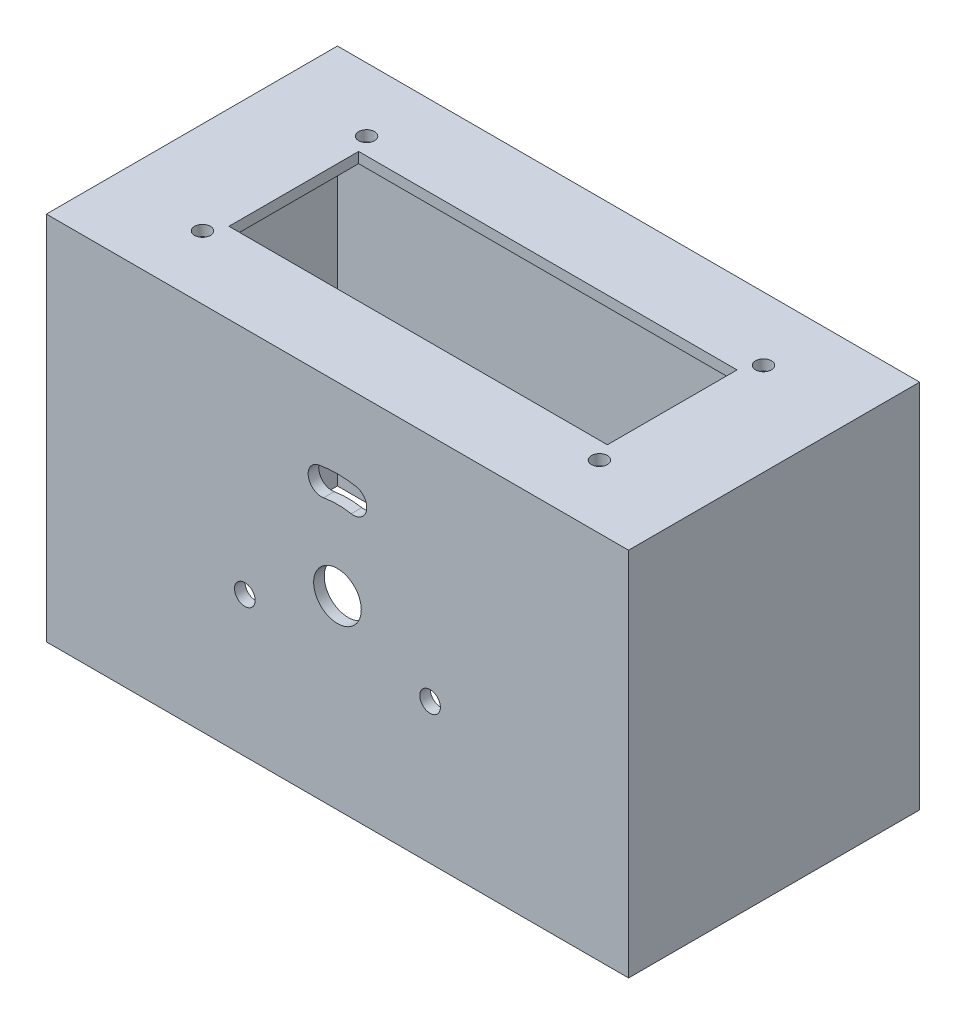
ISO-10303-21;
HEADER;
FILE_DESCRIPTION(('STEP AP214'),'2;1');
FILE_NAME('part.step','',(''),(''),'','','');
FILE_SCHEMA(('AUTOMOTIVE_DESIGN { 1 0 10303 214 1 1 1 1 }'));
ENDSEC;
DATA;
#1=APPLICATION_CONTEXT('core data for automotive mechanical design processes');
#2=APPLICATION_PROTOCOL_DEFINITION('international standard','automotive_design',2000,#1);
#3=PRODUCT_CONTEXT('',#1,'mechanical');
#4=PRODUCT('Part','Part','',(#3));
#5=PRODUCT_RELATED_PRODUCT_CATEGORY('part','',(#4));
#6=PRODUCT_DEFINITION_FORMATION('','',#4);
#7=PRODUCT_DEFINITION_CONTEXT('part definition',#1,'design');
#8=PRODUCT_DEFINITION('design','',#6,#7);
#9=PRODUCT_DEFINITION_SHAPE('','',#8);
#10=(LENGTH_UNIT() NAMED_UNIT(*) SI_UNIT(.MILLI.,.METRE.));
#11=(NAMED_UNIT(*) PLANE_ANGLE_UNIT() SI_UNIT($,.RADIAN.));
#12=(NAMED_UNIT(*) SI_UNIT($,.STERADIAN.) SOLID_ANGLE_UNIT());
#13=UNCERTAINTY_MEASURE_WITH_UNIT(LENGTH_MEASURE(1.E-05),#10,'distance_accuracy_value','');
#14=(GEOMETRIC_REPRESENTATION_CONTEXT(3) GLOBAL_UNCERTAINTY_ASSIGNED_CONTEXT((#13)) GLOBAL_UNIT_ASSIGNED_CONTEXT((#10,
#11,#12)) REPRESENTATION_CONTEXT('',''));
#15=CARTESIAN_POINT('',(0.,0.,0.));
#16=DIRECTION('',(0.,0.,1.));
#17=DIRECTION('',(1.,0.,0.));
#18=AXIS2_PLACEMENT_3D('',#15,#16,#17);
#19=CARTESIAN_POINT('',(0.,35.,27.5));
#20=DIRECTION('',(0.,0.,1.));
#21=DIRECTION('',(1.,0.,0.));
#22=AXIS2_PLACEMENT_3D('',#19,#20,#21);
#23=PLANE('',#22);
#24=CARTESIAN_POINT('',(-17.5,-8.5,27.5));
#25=DIRECTION('',(0.,0.,1.));
#26=DIRECTION('',(1.,0.,0.));
#27=AXIS2_PLACEMENT_3D('',#24,#25,#26);
#28=CIRCLE('',#27,1.95);
#29=CARTESIAN_POINT('',(-15.55,-8.5,27.5));
#30=VERTEX_POINT('',#29);
#31=EDGE_CURVE('E133',#30,#30,#28,.T.);
#32=ORIENTED_EDGE('',*,*,#31,.F.);
#33=EDGE_LOOP('',(#32));
#34=FACE_BOUND('',#33,.T.);
#35=CARTESIAN_POINT('',(17.5,-8.5,27.5));
#36=DIRECTION('',(0.,0.,1.));
#37=DIRECTION('',(1.,0.,0.));
#38=AXIS2_PLACEMENT_3D('',#35,#36,#37);
#39=CIRCLE('',#38,1.95);
#40=CARTESIAN_POINT('',(19.45,-8.5,27.5));
#41=VERTEX_POINT('',#40);
#42=EDGE_CURVE('E275',#41,#41,#39,.T.);
#43=ORIENTED_EDGE('',*,*,#42,.F.);
#44=EDGE_LOOP('',(#43));
#45=FACE_BOUND('',#44,.T.);
#46=CARTESIAN_POINT('',(0.,0.,27.5));
#47=DIRECTION('',(0.,0.,1.));
#48=DIRECTION('',(1.,0.,0.));
#49=AXIS2_PLACEMENT_3D('',#46,#47,#48);
#50=CIRCLE('',#49,4.50000000000004);
#51=CARTESIAN_POINT('',(4.50000000000008,0.,27.5));
#52=VERTEX_POINT('',#51);
#53=EDGE_CURVE('E282',#52,#52,#50,.T.);
#54=ORIENTED_EDGE('',*,*,#53,.F.);
#55=EDGE_LOOP('',(#54));
#56=FACE_BOUND('',#55,.T.);
#57=DIRECTION('',(-1.,0.,0.));
#58=VECTOR('',#57,1.);
#59=CARTESIAN_POINT('',(0.,-35.,27.5));
#60=LINE('',#59,#58);
#61=CARTESIAN_POINT('',(55.,-35.,27.5));
#62=VERTEX_POINT('',#61);
#63=CARTESIAN_POINT('',(-55.,-35.,27.5));
#64=VERTEX_POINT('',#63);
#65=EDGE_CURVE('E376',#62,#64,#60,.T.);
#66=ORIENTED_EDGE('',*,*,#65,.F.);
#67=DIRECTION('',(0.,-1.,0.));
#68=VECTOR('',#67,1.);
#69=CARTESIAN_POINT('',(55.,35.,27.5));
#70=LINE('',#69,#68);
#71=CARTESIAN_POINT('',(55.,35.,27.5));
#72=VERTEX_POINT('',#71);
#73=EDGE_CURVE('E13',#72,#62,#70,.T.);
#74=ORIENTED_EDGE('',*,*,#73,.F.);
#75=DIRECTION('',(-1.,0.,0.));
#76=VECTOR('',#75,1.);
#77=CARTESIAN_POINT('',(0.,35.,27.5));
#78=LINE('',#77,#76);
#79=CARTESIAN_POINT('',(-55.,35.,27.5));
#80=VERTEX_POINT('',#79);
#81=EDGE_CURVE('E352',#72,#80,#78,.T.);
#82=ORIENTED_EDGE('',*,*,#81,.T.);
#83=DIRECTION('',(0.,-1.,0.));
#84=VECTOR('',#83,1.);
#85=CARTESIAN_POINT('',(-55.,35.,27.5));
#86=LINE('',#85,#84);
#87=EDGE_CURVE('E387',#80,#64,#86,.T.);
#88=ORIENTED_EDGE('',*,*,#87,.T.);
#89=EDGE_LOOP('',(#66,#74,#82,#88));
#90=FACE_BOUND('',#89,.T.);
#91=CARTESIAN_POINT('',(0.,0.,27.5));
#92=DIRECTION('',(0.,0.,-1.));
#93=DIRECTION('',(-1.,0.,0.));
#94=AXIS2_PLACEMENT_3D('',#91,#92,#93);
#95=CIRCLE('',#94,15.);
#96=CARTESIAN_POINT('',(-2.604722665004,14.7721162951832,27.5));
#97=VERTEX_POINT('',#96);
#98=CARTESIAN_POINT('',(2.604722665004,14.7721162951832,27.5));
#99=VERTEX_POINT('',#98);
#100=EDGE_CURVE('E252',#97,#99,#95,.T.);
#101=ORIENTED_EDGE('',*,*,#100,.F.);
#102=CARTESIAN_POINT('',(-3.03884310917124,17.2341356777136,27.5));
#103=DIRECTION('',(0.,0.,-1.));
#104=DIRECTION('',(-1.,0.,0.));
#105=AXIS2_PLACEMENT_3D('',#102,#103,#104);
#106=CIRCLE('',#105,2.5);
#107=CARTESIAN_POINT('',(-3.47296355333859,19.6961550602441,27.5));
#108=VERTEX_POINT('',#107);
#109=EDGE_CURVE('E246',#108,#97,#106,.F.);
#110=ORIENTED_EDGE('',*,*,#109,.F.);
#111=CARTESIAN_POINT('',(0.,0.,27.5));
#112=DIRECTION('',(0.,0.,-1.));
#113=DIRECTION('',(-1.,0.,0.));
#114=AXIS2_PLACEMENT_3D('',#111,#112,#113);
#115=CIRCLE('',#114,20.);
#116=CARTESIAN_POINT('',(3.4729635533386,19.6961550602442,27.5));
#117=VERTEX_POINT('',#116);
#118=EDGE_CURVE('E255',#108,#117,#115,.T.);
#119=ORIENTED_EDGE('',*,*,#118,.T.);
#120=CARTESIAN_POINT('',(3.03884310917135,17.2341356777136,27.5));
#121=DIRECTION('',(0.,0.,-1.));
#122=DIRECTION('',(-1.,0.,0.));
#123=AXIS2_PLACEMENT_3D('',#120,#121,#122);
#124=CIRCLE('',#123,2.5);
#125=EDGE_CURVE('E146',#117,#99,#124,.T.);
#126=ORIENTED_EDGE('',*,*,#125,.T.);
#127=EDGE_LOOP('',(#101,#110,#119,#126));
#128=FACE_BOUND('',#127,.T.);
#129=ADVANCED_FACE('F129',(#34,#45,#56,#90,#128),#23,.T.);
#130=CARTESIAN_POINT('',(0.,35.,25.5));
#131=DIRECTION('',(0.,0.,1.));
#132=DIRECTION('',(1.,0.,0.));
#133=AXIS2_PLACEMENT_3D('',#130,#131,#132);
#134=PLANE('',#133);
#135=DIRECTION('',(0.,-1.,0.));
#136=VECTOR('',#135,1.);
#137=CARTESIAN_POINT('',(-53.,35.,25.5));
#138=LINE('',#137,#136);
#139=CARTESIAN_POINT('',(-53.,33.,25.5));
#140=VERTEX_POINT('',#139);
#141=CARTESIAN_POINT('',(-53.,-35.,25.5));
#142=VERTEX_POINT('',#141);
#143=EDGE_CURVE('E397',#140,#142,#138,.T.);
#144=ORIENTED_EDGE('',*,*,#143,.F.);
#145=DIRECTION('',(1.,0.,0.));
#146=VECTOR('',#145,1.);
#147=CARTESIAN_POINT('',(0.,33.,25.5));
#148=LINE('',#147,#146);
#149=CARTESIAN_POINT('',(53.,33.,25.5));
#150=VERTEX_POINT('',#149);
#151=EDGE_CURVE('E347',#140,#150,#148,.T.);
#152=ORIENTED_EDGE('',*,*,#151,.T.);
#153=DIRECTION('',(0.,-1.,0.));
#154=VECTOR('',#153,1.);
#155=CARTESIAN_POINT('',(53.,35.,25.5));
#156=LINE('',#155,#154);
#157=CARTESIAN_POINT('',(53.,-35.,25.5));
#158=VERTEX_POINT('',#157);
#159=EDGE_CURVE('E390',#150,#158,#156,.T.);
#160=ORIENTED_EDGE('',*,*,#159,.T.);
#161=DIRECTION('',(-1.,0.,0.));
#162=VECTOR('',#161,1.);
#163=CARTESIAN_POINT('',(0.,-35.,25.5));
#164=LINE('',#163,#162);
#165=EDGE_CURVE('E367',#158,#142,#164,.T.);
#166=ORIENTED_EDGE('',*,*,#165,.T.);
#167=EDGE_LOOP('',(#144,#152,#160,#166));
#168=FACE_BOUND('',#167,.T.);
#169=CARTESIAN_POINT('',(0.,0.,25.5));
#170=DIRECTION('',(0.,0.,1.));
#171=DIRECTION('',(1.,0.,0.));
#172=AXIS2_PLACEMENT_3D('',#169,#170,#171);
#173=CIRCLE('',#172,4.50000000000004);
#174=CARTESIAN_POINT('',(4.50000000000007,0.,25.5));
#175=VERTEX_POINT('',#174);
#176=EDGE_CURVE('E279',#175,#175,#173,.T.);
#177=ORIENTED_EDGE('',*,*,#176,.T.);
#178=EDGE_LOOP('',(#177));
#179=FACE_BOUND('',#178,.T.);
#180=CARTESIAN_POINT('',(17.5,-8.5,25.5));
#181=DIRECTION('',(0.,0.,1.));
#182=DIRECTION('',(1.,0.,0.));
#183=AXIS2_PLACEMENT_3D('',#180,#181,#182);
#184=CIRCLE('',#183,1.95);
#185=CARTESIAN_POINT('',(19.45,-8.5,25.5));
#186=VERTEX_POINT('',#185);
#187=EDGE_CURVE('E400',#186,#186,#184,.T.);
#188=ORIENTED_EDGE('',*,*,#187,.T.);
#189=EDGE_LOOP('',(#188));
#190=FACE_BOUND('',#189,.T.);
#191=CARTESIAN_POINT('',(-17.5,-8.5,25.5));
#192=DIRECTION('',(0.,0.,1.));
#193=DIRECTION('',(1.,0.,0.));
#194=AXIS2_PLACEMENT_3D('',#191,#192,#193);
#195=CIRCLE('',#194,1.95);
#196=CARTESIAN_POINT('',(-15.55,-8.5,25.5));
#197=VERTEX_POINT('',#196);
#198=EDGE_CURVE('E283',#197,#197,#195,.T.);
#199=ORIENTED_EDGE('',*,*,#198,.T.);
#200=EDGE_LOOP('',(#199));
#201=FACE_BOUND('',#200,.T.);
#202=CARTESIAN_POINT('',(-3.03884310917124,17.2341356777136,25.5000000000001));
#203=DIRECTION('',(0.,0.,-1.));
#204=DIRECTION('',(-1.,0.,0.));
#205=AXIS2_PLACEMENT_3D('',#202,#203,#204);
#206=CIRCLE('',#205,2.5);
#207=CARTESIAN_POINT('',(-3.4729635533386,19.6961550602442,25.5));
#208=VERTEX_POINT('',#207);
#209=CARTESIAN_POINT('',(-2.604722665004,14.7721162951832,25.5000000000001));
#210=VERTEX_POINT('',#209);
#211=EDGE_CURVE('E154',#208,#210,#206,.F.);
#212=ORIENTED_EDGE('',*,*,#211,.T.);
#213=CARTESIAN_POINT('',(0.,0.,25.5000000000001));
#214=DIRECTION('',(0.,0.,-1.));
#215=DIRECTION('',(-1.,0.,0.));
#216=AXIS2_PLACEMENT_3D('',#213,#214,#215);
#217=CIRCLE('',#216,15.);
#218=CARTESIAN_POINT('',(2.604722665004,14.7721162951832,25.5000000000001));
#219=VERTEX_POINT('',#218);
#220=EDGE_CURVE('E260',#210,#219,#217,.T.);
#221=ORIENTED_EDGE('',*,*,#220,.T.);
#222=CARTESIAN_POINT('',(3.03884310917135,17.2341356777136,25.5000000000001));
#223=DIRECTION('',(0.,0.,-1.));
#224=DIRECTION('',(-1.,0.,0.));
#225=AXIS2_PLACEMENT_3D('',#222,#223,#224);
#226=CIRCLE('',#225,2.5);
#227=CARTESIAN_POINT('',(3.47296355333859,19.6961550602441,25.5000000000001));
#228=VERTEX_POINT('',#227);
#229=EDGE_CURVE('E263',#228,#219,#226,.T.);
#230=ORIENTED_EDGE('',*,*,#229,.F.);
#231=CARTESIAN_POINT('',(0.,0.,25.5000000000001));
#232=DIRECTION('',(0.,0.,-1.));
#233=DIRECTION('',(-1.,0.,0.));
#234=AXIS2_PLACEMENT_3D('',#231,#232,#233);
#235=CIRCLE('',#234,20.);
#236=EDGE_CURVE('E269',#208,#228,#235,.T.);
#237=ORIENTED_EDGE('',*,*,#236,.F.);
#238=EDGE_LOOP('',(#212,#221,#230,#237));
#239=FACE_BOUND('',#238,.T.);
#240=ADVANCED_FACE('F413',(#168,#179,#190,#201,#239),#134,.F.);
#241=CARTESIAN_POINT('',(55.,35.,0.));
#242=DIRECTION('',(-1.,0.,0.));
#243=DIRECTION('',(0.,0.,1.));
#244=AXIS2_PLACEMENT_3D('',#241,#242,#243);
#245=PLANE('',#244);
#246=DIRECTION('',(0.,0.,-1.));
#247=VECTOR('',#246,1.);
#248=CARTESIAN_POINT('',(55.,-35.,0.));
#249=LINE('',#248,#247);
#250=CARTESIAN_POINT('',(55.,-35.,-27.5));
#251=VERTEX_POINT('',#250);
#252=EDGE_CURVE('E379',#62,#251,#249,.T.);
#253=ORIENTED_EDGE('',*,*,#252,.T.);
#254=DIRECTION('',(0.,-1.,0.));
#255=VECTOR('',#254,1.);
#256=CARTESIAN_POINT('',(55.,35.,-27.5));
#257=LINE('',#256,#255);
#258=CARTESIAN_POINT('',(55.,35.,-27.5));
#259=VERTEX_POINT('',#258);
#260=EDGE_CURVE('E138',#259,#251,#257,.T.);
#261=ORIENTED_EDGE('',*,*,#260,.F.);
#262=DIRECTION('',(0.,0.,-1.));
#263=VECTOR('',#262,1.);
#264=CARTESIAN_POINT('',(55.,35.,0.));
#265=LINE('',#264,#263);
#266=EDGE_CURVE('E355',#72,#259,#265,.T.);
#267=ORIENTED_EDGE('',*,*,#266,.F.);
#268=ORIENTED_EDGE('',*,*,#73,.T.);
#269=EDGE_LOOP('',(#253,#261,#267,#268));
#270=FACE_BOUND('',#269,.T.);
#271=ADVANCED_FACE('F433',(#270),#245,.F.);
#272=CARTESIAN_POINT('',(0.,35.,-27.5));
#273=DIRECTION('',(0.,0.,1.));
#274=DIRECTION('',(1.,0.,0.));
#275=AXIS2_PLACEMENT_3D('',#272,#273,#274);
#276=PLANE('',#275);
#277=DIRECTION('',(-1.,0.,0.));
#278=VECTOR('',#277,1.);
#279=CARTESIAN_POINT('',(0.,-35.,-27.5));
#280=LINE('',#279,#278);
#281=CARTESIAN_POINT('',(-55.,-35.,-27.5));
#282=VERTEX_POINT('',#281);
#283=EDGE_CURVE('E382',#251,#282,#280,.T.);
#284=ORIENTED_EDGE('',*,*,#283,.T.);
#285=DIRECTION('',(0.,-1.,0.));
#286=VECTOR('',#285,1.);
#287=CARTESIAN_POINT('',(-55.,35.,-27.5));
#288=LINE('',#287,#286);
#289=CARTESIAN_POINT('',(-55.,35.,-27.5));
#290=VERTEX_POINT('',#289);
#291=EDGE_CURVE('E389',#290,#282,#288,.T.);
#292=ORIENTED_EDGE('',*,*,#291,.F.);
#293=DIRECTION('',(-1.,0.,0.));
#294=VECTOR('',#293,1.);
#295=CARTESIAN_POINT('',(0.,35.,-27.5));
#296=LINE('',#295,#294);
#297=EDGE_CURVE('E359',#259,#290,#296,.T.);
#298=ORIENTED_EDGE('',*,*,#297,.F.);
#299=ORIENTED_EDGE('',*,*,#260,.T.);
#300=EDGE_LOOP('',(#284,#292,#298,#299));
#301=FACE_BOUND('',#300,.T.);
#302=ADVANCED_FACE('F430',(#301),#276,.F.);
#303=CARTESIAN_POINT('',(53.,35.,0.));
#304=DIRECTION('',(-1.,0.,0.));
#305=DIRECTION('',(0.,0.,1.));
#306=AXIS2_PLACEMENT_3D('',#303,#304,#305);
#307=PLANE('',#306);
#308=DIRECTION('',(0.,0.,1.));
#309=VECTOR('',#308,1.);
#310=CARTESIAN_POINT('',(53.,33.,0.));
#311=LINE('',#310,#309);
#312=CARTESIAN_POINT('',(53.,33.,-25.5));
#313=VERTEX_POINT('',#312);
#314=EDGE_CURVE('E344',#313,#150,#311,.T.);
#315=ORIENTED_EDGE('',*,*,#314,.F.);
#316=DIRECTION('',(0.,-1.,0.));
#317=VECTOR('',#316,1.);
#318=CARTESIAN_POINT('',(53.,35.,-25.5));
#319=LINE('',#318,#317);
#320=CARTESIAN_POINT('',(53.,-35.,-25.5));
#321=VERTEX_POINT('',#320);
#322=EDGE_CURVE('E364',#313,#321,#319,.T.);
#323=ORIENTED_EDGE('',*,*,#322,.T.);
#324=DIRECTION('',(0.,0.,-1.));
#325=VECTOR('',#324,1.);
#326=CARTESIAN_POINT('',(53.,-35.,0.));
#327=LINE('',#326,#325);
#328=EDGE_CURVE('E351',#158,#321,#327,.T.);
#329=ORIENTED_EDGE('',*,*,#328,.F.);
#330=ORIENTED_EDGE('',*,*,#159,.F.);
#331=EDGE_LOOP('',(#315,#323,#329,#330));
#332=FACE_BOUND('',#331,.T.);
#333=ADVANCED_FACE('F491',(#332),#307,.T.);
#334=CARTESIAN_POINT('',(-53.,35.,0.));
#335=DIRECTION('',(-1.,0.,0.));
#336=DIRECTION('',(0.,0.,1.));
#337=AXIS2_PLACEMENT_3D('',#334,#335,#336);
#338=PLANE('',#337);
#339=DIRECTION('',(0.,-1.,0.));
#340=VECTOR('',#339,1.);
#341=CARTESIAN_POINT('',(-53.,35.,-25.5));
#342=LINE('',#341,#340);
#343=CARTESIAN_POINT('',(-53.,33.,-25.5));
#344=VERTEX_POINT('',#343);
#345=CARTESIAN_POINT('',(-53.,-35.,-25.5));
#346=VERTEX_POINT('',#345);
#347=EDGE_CURVE('E395',#344,#346,#342,.T.);
#348=ORIENTED_EDGE('',*,*,#347,.F.);
#349=DIRECTION('',(0.,0.,1.));
#350=VECTOR('',#349,1.);
#351=CARTESIAN_POINT('',(-53.,33.,0.));
#352=LINE('',#351,#350);
#353=EDGE_CURVE('E349',#344,#140,#352,.T.);
#354=ORIENTED_EDGE('',*,*,#353,.T.);
#355=ORIENTED_EDGE('',*,*,#143,.T.);
#356=DIRECTION('',(0.,0.,-1.));
#357=VECTOR('',#356,1.);
#358=CARTESIAN_POINT('',(-53.,-35.,0.));
#359=LINE('',#358,#357);
#360=EDGE_CURVE('E370',#142,#346,#359,.T.);
#361=ORIENTED_EDGE('',*,*,#360,.T.);
#362=EDGE_LOOP('',(#348,#354,#355,#361));
#363=FACE_BOUND('',#362,.T.);
#364=ADVANCED_FACE('F496',(#363),#338,.F.);
#365=CARTESIAN_POINT('',(0.,35.,-25.5));
#366=DIRECTION('',(0.,0.,1.));
#367=DIRECTION('',(1.,0.,0.));
#368=AXIS2_PLACEMENT_3D('',#365,#366,#367);
#369=PLANE('',#368);
#370=DIRECTION('',(1.,0.,0.));
#371=VECTOR('',#370,1.);
#372=CARTESIAN_POINT('',(0.,33.,-25.5));
#373=LINE('',#372,#371);
#374=EDGE_CURVE('E341',#344,#313,#373,.T.);
#375=ORIENTED_EDGE('',*,*,#374,.F.);
#376=ORIENTED_EDGE('',*,*,#347,.T.);
#377=DIRECTION('',(-1.,0.,0.));
#378=VECTOR('',#377,1.);
#379=CARTESIAN_POINT('',(0.,-35.,-25.5));
#380=LINE('',#379,#378);
#381=EDGE_CURVE('E373',#321,#346,#380,.T.);
#382=ORIENTED_EDGE('',*,*,#381,.F.);
#383=ORIENTED_EDGE('',*,*,#322,.F.);
#384=EDGE_LOOP('',(#375,#376,#382,#383));
#385=FACE_BOUND('',#384,.T.);
#386=ADVANCED_FACE('F488',(#385),#369,.T.);
#387=CARTESIAN_POINT('',(-55.,35.,0.));
#388=DIRECTION('',(-1.,0.,0.));
#389=DIRECTION('',(0.,0.,1.));
#390=AXIS2_PLACEMENT_3D('',#387,#388,#389);
#391=PLANE('',#390);
#392=DIRECTION('',(0.,0.,-1.));
#393=VECTOR('',#392,1.);
#394=CARTESIAN_POINT('',(-55.,-35.,0.));
#395=LINE('',#394,#393);
#396=EDGE_CURVE('E356',#64,#282,#395,.T.);
#397=ORIENTED_EDGE('',*,*,#396,.F.);
#398=ORIENTED_EDGE('',*,*,#87,.F.);
#399=DIRECTION('',(0.,0.,-1.));
#400=VECTOR('',#399,1.);
#401=CARTESIAN_POINT('',(-55.,35.,0.));
#402=LINE('',#401,#400);
#403=EDGE_CURVE('E361',#80,#290,#402,.T.);
#404=ORIENTED_EDGE('',*,*,#403,.T.);
#405=ORIENTED_EDGE('',*,*,#291,.T.);
#406=EDGE_LOOP('',(#397,#398,#404,#405));
#407=FACE_BOUND('',#406,.T.);
#408=ADVANCED_FACE('F426',(#407),#391,.T.);
#409=CARTESIAN_POINT('',(0.,35.,0.));
#410=DIRECTION('',(0.,1.,0.));
#411=DIRECTION('',(0.,0.,1.));
#412=AXIS2_PLACEMENT_3D('',#409,#410,#411);
#413=PLANE('',#412);
#414=ORIENTED_EDGE('',*,*,#81,.F.);
#415=ORIENTED_EDGE('',*,*,#266,.T.);
#416=ORIENTED_EDGE('',*,*,#297,.T.);
#417=ORIENTED_EDGE('',*,*,#403,.F.);
#418=EDGE_LOOP('',(#414,#415,#416,#417));
#419=FACE_BOUND('',#418,.T.);
#420=CARTESIAN_POINT('',(-37.5,35.,15.5));
#421=DIRECTION('',(0.,1.,0.));
#422=DIRECTION('',(0.,0.,1.));
#423=AXIS2_PLACEMENT_3D('',#420,#421,#422);
#424=CIRCLE('',#423,1.5);
#425=CARTESIAN_POINT('',(-37.5,35.,17.));
#426=VERTEX_POINT('',#425);
#427=EDGE_CURVE('E286',#426,#426,#424,.T.);
#428=ORIENTED_EDGE('',*,*,#427,.F.);
#429=EDGE_LOOP('',(#428));
#430=FACE_BOUND('',#429,.T.);
#431=CARTESIAN_POINT('',(-37.5,35.,-15.5));
#432=DIRECTION('',(0.,1.,0.));
#433=DIRECTION('',(0.,0.,1.));
#434=AXIS2_PLACEMENT_3D('',#431,#432,#433);
#435=CIRCLE('',#434,1.5);
#436=CARTESIAN_POINT('',(-37.5,35.,-14.));
#437=VERTEX_POINT('',#436);
#438=EDGE_CURVE('E290',#437,#437,#435,.T.);
#439=ORIENTED_EDGE('',*,*,#438,.F.);
#440=EDGE_LOOP('',(#439));
#441=FACE_BOUND('',#440,.T.);
#442=CARTESIAN_POINT('',(37.5,35.,-15.5));
#443=DIRECTION('',(0.,1.,0.));
#444=DIRECTION('',(0.,0.,1.));
#445=AXIS2_PLACEMENT_3D('',#442,#443,#444);
#446=CIRCLE('',#445,1.5);
#447=CARTESIAN_POINT('',(37.5,35.,-14.));
#448=VERTEX_POINT('',#447);
#449=EDGE_CURVE('E296',#448,#448,#446,.T.);
#450=ORIENTED_EDGE('',*,*,#449,.F.);
#451=EDGE_LOOP('',(#450));
#452=FACE_BOUND('',#451,.T.);
#453=CARTESIAN_POINT('',(37.5,35.,15.5));
#454=DIRECTION('',(0.,1.,0.));
#455=DIRECTION('',(0.,0.,1.));
#456=AXIS2_PLACEMENT_3D('',#453,#454,#455);
#457=CIRCLE('',#456,1.5);
#458=CARTESIAN_POINT('',(37.5,35.,17.));
#459=VERTEX_POINT('',#458);
#460=EDGE_CURVE('E302',#459,#459,#457,.T.);
#461=ORIENTED_EDGE('',*,*,#460,.F.);
#462=EDGE_LOOP('',(#461));
#463=FACE_BOUND('',#462,.T.);
#464=DIRECTION('',(0.,0.,1.));
#465=VECTOR('',#464,1.);
#466=CARTESIAN_POINT('',(35.75,35.,0.));
#467=LINE('',#466,#465);
#468=CARTESIAN_POINT('',(35.75,35.,-12.25));
#469=VERTEX_POINT('',#468);
#470=CARTESIAN_POINT('',(35.75,35.,12.25));
#471=VERTEX_POINT('',#470);
#472=EDGE_CURVE('E308',#469,#471,#467,.T.);
#473=ORIENTED_EDGE('',*,*,#472,.T.);
#474=DIRECTION('',(1.,0.,0.));
#475=VECTOR('',#474,1.);
#476=CARTESIAN_POINT('',(0.,35.,12.25));
#477=LINE('',#476,#475);
#478=CARTESIAN_POINT('',(-35.75,35.,12.25));
#479=VERTEX_POINT('',#478);
#480=EDGE_CURVE('E325',#479,#471,#477,.T.);
#481=ORIENTED_EDGE('',*,*,#480,.F.);
#482=DIRECTION('',(0.,0.,1.));
#483=VECTOR('',#482,1.);
#484=CARTESIAN_POINT('',(-35.75,35.,0.));
#485=LINE('',#484,#483);
#486=CARTESIAN_POINT('',(-35.75,35.,-12.25));
#487=VERTEX_POINT('',#486);
#488=EDGE_CURVE('E328',#487,#479,#485,.T.);
#489=ORIENTED_EDGE('',*,*,#488,.F.);
#490=DIRECTION('',(1.,0.,0.));
#491=VECTOR('',#490,1.);
#492=CARTESIAN_POINT('',(0.,35.,-12.25));
#493=LINE('',#492,#491);
#494=EDGE_CURVE('E314',#487,#469,#493,.T.);
#495=ORIENTED_EDGE('',*,*,#494,.T.);
#496=EDGE_LOOP('',(#473,#481,#489,#495));
#497=FACE_BOUND('',#496,.T.);
#498=ADVANCED_FACE('F436',(#419,#430,#441,#452,#463,#497),#413,.T.);
#499=CARTESIAN_POINT('',(0.,-35.,0.));
#500=DIRECTION('',(0.,1.,0.));
#501=DIRECTION('',(0.,0.,1.));
#502=AXIS2_PLACEMENT_3D('',#499,#500,#501);
#503=PLANE('',#502);
#504=ORIENTED_EDGE('',*,*,#328,.T.);
#505=ORIENTED_EDGE('',*,*,#381,.T.);
#506=ORIENTED_EDGE('',*,*,#360,.F.);
#507=ORIENTED_EDGE('',*,*,#165,.F.);
#508=EDGE_LOOP('',(#504,#505,#506,#507));
#509=FACE_BOUND('',#508,.T.);
#510=ORIENTED_EDGE('',*,*,#65,.T.);
#511=ORIENTED_EDGE('',*,*,#396,.T.);
#512=ORIENTED_EDGE('',*,*,#283,.F.);
#513=ORIENTED_EDGE('',*,*,#252,.F.);
#514=EDGE_LOOP('',(#510,#511,#512,#513));
#515=FACE_BOUND('',#514,.T.);
#516=ADVANCED_FACE('F424',(#509,#515),#503,.F.);
#517=CARTESIAN_POINT('',(0.,33.,0.));
#518=DIRECTION('',(0.,-1.,0.));
#519=DIRECTION('',(0.,0.,-1.));
#520=AXIS2_PLACEMENT_3D('',#517,#518,#519);
#521=PLANE('',#520);
#522=CARTESIAN_POINT('',(-37.5,33.,15.5));
#523=DIRECTION('',(0.,1.,0.));
#524=DIRECTION('',(0.,0.,1.));
#525=AXIS2_PLACEMENT_3D('',#522,#523,#524);
#526=CIRCLE('',#525,1.5);
#527=CARTESIAN_POINT('',(-37.5,33.,17.));
#528=VERTEX_POINT('',#527);
#529=EDGE_CURVE('E287',#528,#528,#526,.T.);
#530=ORIENTED_EDGE('',*,*,#529,.T.);
#531=EDGE_LOOP('',(#530));
#532=FACE_BOUND('',#531,.T.);
#533=CARTESIAN_POINT('',(-37.5,33.,-15.5));
#534=DIRECTION('',(0.,1.,0.));
#535=DIRECTION('',(0.,0.,1.));
#536=AXIS2_PLACEMENT_3D('',#533,#534,#535);
#537=CIRCLE('',#536,1.5);
#538=CARTESIAN_POINT('',(-37.5,33.,-14.));
#539=VERTEX_POINT('',#538);
#540=EDGE_CURVE('E293',#539,#539,#537,.T.);
#541=ORIENTED_EDGE('',*,*,#540,.T.);
#542=EDGE_LOOP('',(#541));
#543=FACE_BOUND('',#542,.T.);
#544=CARTESIAN_POINT('',(37.5,33.,-15.5));
#545=DIRECTION('',(0.,1.,0.));
#546=DIRECTION('',(0.,0.,1.));
#547=AXIS2_PLACEMENT_3D('',#544,#545,#546);
#548=CIRCLE('',#547,1.5);
#549=CARTESIAN_POINT('',(37.5,33.,-14.));
#550=VERTEX_POINT('',#549);
#551=EDGE_CURVE('E299',#550,#550,#548,.T.);
#552=ORIENTED_EDGE('',*,*,#551,.T.);
#553=EDGE_LOOP('',(#552));
#554=FACE_BOUND('',#553,.T.);
#555=CARTESIAN_POINT('',(37.5,33.,15.5));
#556=DIRECTION('',(0.,1.,0.));
#557=DIRECTION('',(0.,0.,1.));
#558=AXIS2_PLACEMENT_3D('',#555,#556,#557);
#559=CIRCLE('',#558,1.5);
#560=CARTESIAN_POINT('',(37.5,33.,17.));
#561=VERTEX_POINT('',#560);
#562=EDGE_CURVE('E305',#561,#561,#559,.T.);
#563=ORIENTED_EDGE('',*,*,#562,.T.);
#564=EDGE_LOOP('',(#563));
#565=FACE_BOUND('',#564,.T.);
#566=ORIENTED_EDGE('',*,*,#374,.T.);
#567=ORIENTED_EDGE('',*,*,#314,.T.);
#568=ORIENTED_EDGE('',*,*,#151,.F.);
#569=ORIENTED_EDGE('',*,*,#353,.F.);
#570=EDGE_LOOP('',(#566,#567,#568,#569));
#571=FACE_BOUND('',#570,.T.);
#572=DIRECTION('',(1.,0.,0.));
#573=VECTOR('',#572,1.);
#574=CARTESIAN_POINT('',(0.,33.,12.25));
#575=LINE('',#574,#573);
#576=CARTESIAN_POINT('',(-35.75,33.,12.25));
#577=VERTEX_POINT('',#576);
#578=CARTESIAN_POINT('',(35.75,33.,12.25));
#579=VERTEX_POINT('',#578);
#580=EDGE_CURVE('E313',#577,#579,#575,.T.);
#581=ORIENTED_EDGE('',*,*,#580,.T.);
#582=DIRECTION('',(0.,0.,1.));
#583=VECTOR('',#582,1.);
#584=CARTESIAN_POINT('',(35.75,33.,0.));
#585=LINE('',#584,#583);
#586=CARTESIAN_POINT('',(35.75,33.,-12.25));
#587=VERTEX_POINT('',#586);
#588=EDGE_CURVE('E311',#587,#579,#585,.T.);
#589=ORIENTED_EDGE('',*,*,#588,.F.);
#590=DIRECTION('',(1.,0.,0.));
#591=VECTOR('',#590,1.);
#592=CARTESIAN_POINT('',(0.,33.,-12.25));
#593=LINE('',#592,#591);
#594=CARTESIAN_POINT('',(-35.75,33.,-12.25));
#595=VERTEX_POINT('',#594);
#596=EDGE_CURVE('E320',#595,#587,#593,.T.);
#597=ORIENTED_EDGE('',*,*,#596,.F.);
#598=DIRECTION('',(0.,0.,1.));
#599=VECTOR('',#598,1.);
#600=CARTESIAN_POINT('',(-35.75,33.,0.));
#601=LINE('',#600,#599);
#602=EDGE_CURVE('E317',#595,#577,#601,.T.);
#603=ORIENTED_EDGE('',*,*,#602,.T.);
#604=EDGE_LOOP('',(#581,#589,#597,#603));
#605=FACE_BOUND('',#604,.T.);
#606=ADVANCED_FACE('F461',(#532,#543,#554,#565,#571,#605),#521,.T.);
#607=CARTESIAN_POINT('',(35.75,33.,0.));
#608=DIRECTION('',(-1.,0.,0.));
#609=DIRECTION('',(0.,0.,1.));
#610=AXIS2_PLACEMENT_3D('',#607,#608,#609);
#611=PLANE('',#610);
#612=ORIENTED_EDGE('',*,*,#472,.F.);
#613=DIRECTION('',(0.,1.,0.));
#614=VECTOR('',#613,1.);
#615=CARTESIAN_POINT('',(35.75,33.,-12.25));
#616=LINE('',#615,#614);
#617=EDGE_CURVE('E322',#587,#469,#616,.T.);
#618=ORIENTED_EDGE('',*,*,#617,.F.);
#619=ORIENTED_EDGE('',*,*,#588,.T.);
#620=DIRECTION('',(0.,1.,0.));
#621=VECTOR('',#620,1.);
#622=CARTESIAN_POINT('',(35.75,33.,12.25));
#623=LINE('',#622,#621);
#624=EDGE_CURVE('E339',#579,#471,#623,.T.);
#625=ORIENTED_EDGE('',*,*,#624,.T.);
#626=EDGE_LOOP('',(#612,#618,#619,#625));
#627=FACE_BOUND('',#626,.T.);
#628=ADVANCED_FACE('F453',(#627),#611,.T.);
#629=CARTESIAN_POINT('',(0.,33.,12.25));
#630=DIRECTION('',(0.,0.,1.));
#631=DIRECTION('',(1.,0.,0.));
#632=AXIS2_PLACEMENT_3D('',#629,#630,#631);
#633=PLANE('',#632);
#634=ORIENTED_EDGE('',*,*,#480,.T.);
#635=ORIENTED_EDGE('',*,*,#624,.F.);
#636=ORIENTED_EDGE('',*,*,#580,.F.);
#637=DIRECTION('',(0.,1.,0.));
#638=VECTOR('',#637,1.);
#639=CARTESIAN_POINT('',(-35.75,33.,12.25));
#640=LINE('',#639,#638);
#641=EDGE_CURVE('E337',#577,#479,#640,.T.);
#642=ORIENTED_EDGE('',*,*,#641,.T.);
#643=EDGE_LOOP('',(#634,#635,#636,#642));
#644=FACE_BOUND('',#643,.T.);
#645=ADVANCED_FACE('F464',(#644),#633,.F.);
#646=CARTESIAN_POINT('',(-35.75,33.,0.));
#647=DIRECTION('',(-1.,0.,0.));
#648=DIRECTION('',(0.,0.,1.));
#649=AXIS2_PLACEMENT_3D('',#646,#647,#648);
#650=PLANE('',#649);
#651=ORIENTED_EDGE('',*,*,#488,.T.);
#652=ORIENTED_EDGE('',*,*,#641,.F.);
#653=ORIENTED_EDGE('',*,*,#602,.F.);
#654=DIRECTION('',(0.,1.,0.));
#655=VECTOR('',#654,1.);
#656=CARTESIAN_POINT('',(-35.75,33.,-12.25));
#657=LINE('',#656,#655);
#658=EDGE_CURVE('E335',#595,#487,#657,.T.);
#659=ORIENTED_EDGE('',*,*,#658,.T.);
#660=EDGE_LOOP('',(#651,#652,#653,#659));
#661=FACE_BOUND('',#660,.T.);
#662=ADVANCED_FACE('F466',(#661),#650,.F.);
#663=CARTESIAN_POINT('',(0.,33.,-12.25));
#664=DIRECTION('',(0.,0.,1.));
#665=DIRECTION('',(1.,0.,0.));
#666=AXIS2_PLACEMENT_3D('',#663,#664,#665);
#667=PLANE('',#666);
#668=ORIENTED_EDGE('',*,*,#494,.F.);
#669=ORIENTED_EDGE('',*,*,#658,.F.);
#670=ORIENTED_EDGE('',*,*,#596,.T.);
#671=ORIENTED_EDGE('',*,*,#617,.T.);
#672=EDGE_LOOP('',(#668,#669,#670,#671));
#673=FACE_BOUND('',#672,.T.);
#674=ADVANCED_FACE('F457',(#673),#667,.T.);
#675=CARTESIAN_POINT('',(37.5,33.,15.5));
#676=DIRECTION('',(0.,1.,0.));
#677=DIRECTION('',(0.,0.,1.));
#678=AXIS2_PLACEMENT_3D('',#675,#676,#677);
#679=CYLINDRICAL_SURFACE('',#678,1.5);
#680=ORIENTED_EDGE('',*,*,#562,.F.);
#681=EDGE_LOOP('',(#680));
#682=FACE_BOUND('',#681,.T.);
#683=ORIENTED_EDGE('',*,*,#460,.T.);
#684=EDGE_LOOP('',(#683));
#685=FACE_BOUND('',#684,.T.);
#686=ADVANCED_FACE('F473',(#682,#685),#679,.F.);
#687=CARTESIAN_POINT('',(37.5,33.,-15.5));
#688=DIRECTION('',(0.,1.,0.));
#689=DIRECTION('',(0.,0.,1.));
#690=AXIS2_PLACEMENT_3D('',#687,#688,#689);
#691=CYLINDRICAL_SURFACE('',#690,1.5);
#692=ORIENTED_EDGE('',*,*,#551,.F.);
#693=EDGE_LOOP('',(#692));
#694=FACE_BOUND('',#693,.T.);
#695=ORIENTED_EDGE('',*,*,#449,.T.);
#696=EDGE_LOOP('',(#695));
#697=FACE_BOUND('',#696,.T.);
#698=ADVANCED_FACE('F543',(#694,#697),#691,.F.);
#699=CARTESIAN_POINT('',(-37.5,33.,-15.5));
#700=DIRECTION('',(0.,1.,0.));
#701=DIRECTION('',(0.,0.,1.));
#702=AXIS2_PLACEMENT_3D('',#699,#700,#701);
#703=CYLINDRICAL_SURFACE('',#702,1.5);
#704=ORIENTED_EDGE('',*,*,#540,.F.);
#705=EDGE_LOOP('',(#704));
#706=FACE_BOUND('',#705,.T.);
#707=ORIENTED_EDGE('',*,*,#438,.T.);
#708=EDGE_LOOP('',(#707));
#709=FACE_BOUND('',#708,.T.);
#710=ADVANCED_FACE('F539',(#706,#709),#703,.F.);
#711=CARTESIAN_POINT('',(-37.5,33.,15.5));
#712=DIRECTION('',(0.,1.,0.));
#713=DIRECTION('',(0.,0.,1.));
#714=AXIS2_PLACEMENT_3D('',#711,#712,#713);
#715=CYLINDRICAL_SURFACE('',#714,1.5);
#716=ORIENTED_EDGE('',*,*,#529,.F.);
#717=EDGE_LOOP('',(#716));
#718=FACE_BOUND('',#717,.T.);
#719=ORIENTED_EDGE('',*,*,#427,.T.);
#720=EDGE_LOOP('',(#719));
#721=FACE_BOUND('',#720,.T.);
#722=ADVANCED_FACE('F515',(#718,#721),#715,.F.);
#723=CARTESIAN_POINT('',(0.,0.,6.00000000000002));
#724=DIRECTION('',(0.,0.,1.));
#725=DIRECTION('',(1.,0.,0.));
#726=AXIS2_PLACEMENT_3D('',#723,#724,#725);
#727=CYLINDRICAL_SURFACE('',#726,4.50000000000004);
#728=ORIENTED_EDGE('',*,*,#176,.F.);
#729=EDGE_LOOP('',(#728));
#730=FACE_BOUND('',#729,.T.);
#731=ORIENTED_EDGE('',*,*,#53,.T.);
#732=EDGE_LOOP('',(#731));
#733=FACE_BOUND('',#732,.T.);
#734=ADVANCED_FACE('F508',(#730,#733),#727,.F.);
#735=CARTESIAN_POINT('',(17.5,-8.5,25.5));
#736=DIRECTION('',(0.,0.,1.));
#737=DIRECTION('',(1.,0.,0.));
#738=AXIS2_PLACEMENT_3D('',#735,#736,#737);
#739=CYLINDRICAL_SURFACE('',#738,1.95);
#740=ORIENTED_EDGE('',*,*,#187,.F.);
#741=EDGE_LOOP('',(#740));
#742=FACE_BOUND('',#741,.T.);
#743=ORIENTED_EDGE('',*,*,#42,.T.);
#744=EDGE_LOOP('',(#743));
#745=FACE_BOUND('',#744,.T.);
#746=ADVANCED_FACE('F506',(#742,#745),#739,.F.);
#747=CARTESIAN_POINT('',(-17.5,-8.5,25.5));
#748=DIRECTION('',(0.,0.,1.));
#749=DIRECTION('',(1.,0.,0.));
#750=AXIS2_PLACEMENT_3D('',#747,#748,#749);
#751=CYLINDRICAL_SURFACE('',#750,1.95);
#752=ORIENTED_EDGE('',*,*,#198,.F.);
#753=EDGE_LOOP('',(#752));
#754=FACE_BOUND('',#753,.T.);
#755=ORIENTED_EDGE('',*,*,#31,.T.);
#756=EDGE_LOOP('',(#755));
#757=FACE_BOUND('',#756,.T.);
#758=ADVANCED_FACE('F131',(#754,#757),#751,.F.);
#759=CARTESIAN_POINT('',(-3.03884310917124,17.2341356777136,27.5));
#760=DIRECTION('',(0.,0.,-1.));
#761=DIRECTION('',(-1.,0.,0.));
#762=AXIS2_PLACEMENT_3D('',#759,#760,#761);
#763=CYLINDRICAL_SURFACE('',#762,2.5);
#764=ORIENTED_EDGE('',*,*,#211,.F.);
#765=DIRECTION('',(0.,0.,-1.));
#766=VECTOR('',#765,1.);
#767=CARTESIAN_POINT('',(-3.47296355333859,19.6961550602441,27.5));
#768=LINE('',#767,#766);
#769=EDGE_CURVE('E242',#108,#208,#768,.T.);
#770=ORIENTED_EDGE('',*,*,#769,.F.);
#771=ORIENTED_EDGE('',*,*,#109,.T.);
#772=DIRECTION('',(0.,0.,-1.));
#773=VECTOR('',#772,1.);
#774=CARTESIAN_POINT('',(-2.604722665004,14.7721162951832,27.5));
#775=LINE('',#774,#773);
#776=EDGE_CURVE('E273',#97,#210,#775,.T.);
#777=ORIENTED_EDGE('',*,*,#776,.T.);
#778=EDGE_LOOP('',(#764,#770,#771,#777));
#779=FACE_BOUND('',#778,.T.);
#780=ADVANCED_FACE('F244',(#779),#763,.F.);
#781=CARTESIAN_POINT('',(0.,0.,27.5));
#782=DIRECTION('',(0.,0.,-1.));
#783=DIRECTION('',(-1.,0.,0.));
#784=AXIS2_PLACEMENT_3D('',#781,#782,#783);
#785=CYLINDRICAL_SURFACE('',#784,15.);
#786=ORIENTED_EDGE('',*,*,#220,.F.);
#787=ORIENTED_EDGE('',*,*,#776,.F.);
#788=ORIENTED_EDGE('',*,*,#100,.T.);
#789=DIRECTION('',(0.,0.,-1.));
#790=VECTOR('',#789,1.);
#791=CARTESIAN_POINT('',(2.604722665004,14.7721162951832,27.5));
#792=LINE('',#791,#790);
#793=EDGE_CURVE('E276',#99,#219,#792,.T.);
#794=ORIENTED_EDGE('',*,*,#793,.T.);
#795=EDGE_LOOP('',(#786,#787,#788,#794));
#796=FACE_BOUND('',#795,.T.);
#797=ADVANCED_FACE('F525',(#796),#785,.T.);
#798=CARTESIAN_POINT('',(3.03884310917135,17.2341356777136,27.5));
#799=DIRECTION('',(0.,0.,-1.));
#800=DIRECTION('',(-1.,0.,0.));
#801=AXIS2_PLACEMENT_3D('',#798,#799,#800);
#802=CYLINDRICAL_SURFACE('',#801,2.5);
#803=ORIENTED_EDGE('',*,*,#229,.T.);
#804=ORIENTED_EDGE('',*,*,#793,.F.);
#805=ORIENTED_EDGE('',*,*,#125,.F.);
#806=DIRECTION('',(0.,0.,-1.));
#807=VECTOR('',#806,1.);
#808=CARTESIAN_POINT('',(3.47296355333859,19.6961550602441,27.5));
#809=LINE('',#808,#807);
#810=EDGE_CURVE('E251',#117,#228,#809,.T.);
#811=ORIENTED_EDGE('',*,*,#810,.T.);
#812=EDGE_LOOP('',(#803,#804,#805,#811));
#813=FACE_BOUND('',#812,.T.);
#814=ADVANCED_FACE('F523',(#813),#802,.F.);
#815=CARTESIAN_POINT('',(0.,0.,27.5));
#816=DIRECTION('',(0.,0.,-1.));
#817=DIRECTION('',(-1.,0.,0.));
#818=AXIS2_PLACEMENT_3D('',#815,#816,#817);
#819=CYLINDRICAL_SURFACE('',#818,20.);
#820=ORIENTED_EDGE('',*,*,#236,.T.);
#821=ORIENTED_EDGE('',*,*,#810,.F.);
#822=ORIENTED_EDGE('',*,*,#118,.F.);
#823=ORIENTED_EDGE('',*,*,#769,.T.);
#824=EDGE_LOOP('',(#820,#821,#822,#823));
#825=FACE_BOUND('',#824,.T.);
#826=ADVANCED_FACE('F256',(#825),#819,.F.);
#827=CLOSED_SHELL('',(#129,#240,#271,#302,#333,#364,#386,#408,#498,#516,#606,#628,#645,#662,
#674,#686,#698,#710,#722,#734,#746,#758,#780,#797,#814,#826));
#828=MANIFOLD_SOLID_BREP('B2',#827);
#829=ADVANCED_BREP_SHAPE_REPRESENTATION('',(#18,#828),#14);
#830=SHAPE_DEFINITION_REPRESENTATION(#9,#829);
ENDSEC;
END-ISO-10303-21;
